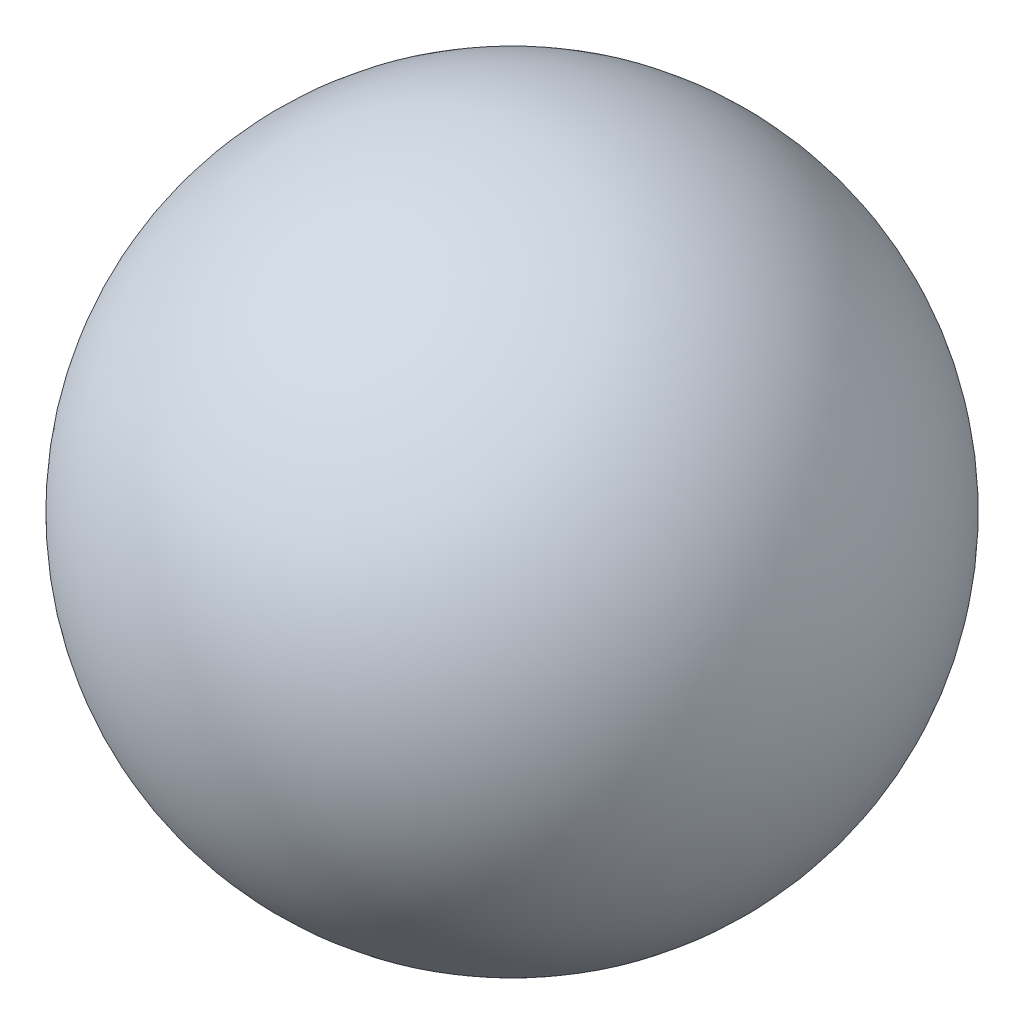
ISO-10303-21;
HEADER;
FILE_DESCRIPTION(('STEP AP214'),'2;1');
FILE_NAME('part.step','',(''),(''),'','','');
FILE_SCHEMA(('AUTOMOTIVE_DESIGN { 1 0 10303 214 1 1 1 1 }'));
ENDSEC;
DATA;
#1=APPLICATION_CONTEXT('core data for automotive mechanical design processes');
#2=APPLICATION_PROTOCOL_DEFINITION('international standard','automotive_design',2000,#1);
#3=PRODUCT_CONTEXT('',#1,'mechanical');
#4=PRODUCT('Part','Part','',(#3));
#5=PRODUCT_RELATED_PRODUCT_CATEGORY('part','',(#4));
#6=PRODUCT_DEFINITION_FORMATION('','',#4);
#7=PRODUCT_DEFINITION_CONTEXT('part definition',#1,'design');
#8=PRODUCT_DEFINITION('design','',#6,#7);
#9=PRODUCT_DEFINITION_SHAPE('','',#8);
#10=(LENGTH_UNIT() NAMED_UNIT(*) SI_UNIT(.MILLI.,.METRE.));
#11=(NAMED_UNIT(*) PLANE_ANGLE_UNIT() SI_UNIT($,.RADIAN.));
#12=(NAMED_UNIT(*) SI_UNIT($,.STERADIAN.) SOLID_ANGLE_UNIT());
#13=UNCERTAINTY_MEASURE_WITH_UNIT(LENGTH_MEASURE(1.E-05),#10,'distance_accuracy_value','');
#14=(GEOMETRIC_REPRESENTATION_CONTEXT(3) GLOBAL_UNCERTAINTY_ASSIGNED_CONTEXT((#13)) GLOBAL_UNIT_ASSIGNED_CONTEXT((#10,
#11,#12)) REPRESENTATION_CONTEXT('',''));
#15=CARTESIAN_POINT('',(0.,0.,0.));
#16=DIRECTION('',(0.,0.,1.));
#17=DIRECTION('',(1.,0.,0.));
#18=AXIS2_PLACEMENT_3D('',#15,#16,#17);
#19=CARTESIAN_POINT('',(0.,0.,0.));
#20=DIRECTION('',(0.,1.,0.));
#21=DIRECTION('',(1.,0.,0.));
#22=AXIS2_PLACEMENT_3D('',#19,#20,#21);
#23=SPHERICAL_SURFACE('',#22,763.39);
#24=CARTESIAN_POINT('',(0.,763.39,0.));
#25=VERTEX_POINT('',#24);
#26=VERTEX_LOOP('',#25);
#27=FACE_BOUND('',#26,.T.);
#28=ADVANCED_FACE('F33',(#27),#23,.T.);
#29=CLOSED_SHELL('',(#28));
#30=CARTESIAN_POINT('',(0.,0.,0.));
#31=DIRECTION('',(0.,1.,0.));
#32=DIRECTION('',(-1.,0.,0.));
#33=AXIS2_PLACEMENT_3D('',#30,#31,#32);
#34=SPHERICAL_SURFACE('',#33,760.);
#35=CARTESIAN_POINT('',(0.,760.,0.));
#36=VERTEX_POINT('',#35);
#37=VERTEX_LOOP('',#36);
#38=FACE_BOUND('',#37,.T.);
#39=ADVANCED_FACE('F35',(#38),#34,.F.);
#40=CLOSED_SHELL('',(#39));
#41=ORIENTED_CLOSED_SHELL('',*,#40,.T.);
#42=BREP_WITH_VOIDS('B2',#29,(#41));
#43=ADVANCED_BREP_SHAPE_REPRESENTATION('',(#18,#42),#14);
#44=SHAPE_DEFINITION_REPRESENTATION(#9,#43);
ENDSEC;
END-ISO-10303-21;
